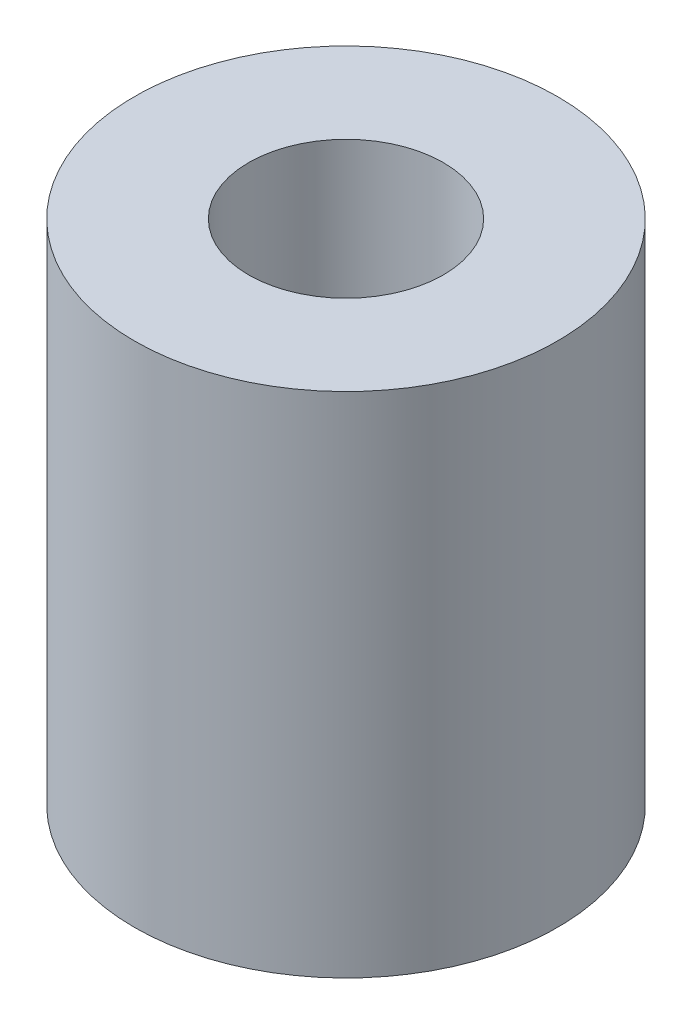
ISO-10303-21;
HEADER;
FILE_DESCRIPTION(('STEP AP214'),'2;1');
FILE_NAME('part.step','',(''),(''),'','','');
FILE_SCHEMA(('AUTOMOTIVE_DESIGN { 1 0 10303 214 1 1 1 1 }'));
ENDSEC;
DATA;
#1=APPLICATION_CONTEXT('core data for automotive mechanical design processes');
#2=APPLICATION_PROTOCOL_DEFINITION('international standard','automotive_design',2000,#1);
#3=PRODUCT_CONTEXT('',#1,'mechanical');
#4=PRODUCT('Part','Part','',(#3));
#5=PRODUCT_RELATED_PRODUCT_CATEGORY('part','',(#4));
#6=PRODUCT_DEFINITION_FORMATION('','',#4);
#7=PRODUCT_DEFINITION_CONTEXT('part definition',#1,'design');
#8=PRODUCT_DEFINITION('design','',#6,#7);
#9=PRODUCT_DEFINITION_SHAPE('','',#8);
#10=(LENGTH_UNIT() NAMED_UNIT(*) SI_UNIT(.MILLI.,.METRE.));
#11=(NAMED_UNIT(*) PLANE_ANGLE_UNIT() SI_UNIT($,.RADIAN.));
#12=(NAMED_UNIT(*) SI_UNIT($,.STERADIAN.) SOLID_ANGLE_UNIT());
#13=UNCERTAINTY_MEASURE_WITH_UNIT(LENGTH_MEASURE(1.E-05),#10,'distance_accuracy_value','');
#14=(GEOMETRIC_REPRESENTATION_CONTEXT(3) GLOBAL_UNCERTAINTY_ASSIGNED_CONTEXT((#13)) GLOBAL_UNIT_ASSIGNED_CONTEXT((#10,
#11,#12)) REPRESENTATION_CONTEXT('',''));
#15=CARTESIAN_POINT('',(0.,0.,0.));
#16=DIRECTION('',(0.,0.,1.));
#17=DIRECTION('',(1.,0.,0.));
#18=AXIS2_PLACEMENT_3D('',#15,#16,#17);
#19=CARTESIAN_POINT('',(0.,0.,0.));
#20=DIRECTION('',(0.,-1.,0.));
#21=DIRECTION('',(0.,0.,-1.));
#22=AXIS2_PLACEMENT_3D('',#19,#20,#21);
#23=CYLINDRICAL_SURFACE('',#22,2.3);
#24=CARTESIAN_POINT('',(0.,0.,0.));
#25=DIRECTION('',(0.,-1.,0.));
#26=DIRECTION('',(0.,0.,-1.));
#27=AXIS2_PLACEMENT_3D('',#24,#25,#26);
#28=CIRCLE('',#27,2.3);
#29=CARTESIAN_POINT('',(0.,0.,-2.3));
#30=VERTEX_POINT('',#29);
#31=EDGE_CURVE('E10',#30,#30,#28,.T.);
#32=ORIENTED_EDGE('',*,*,#31,.T.);
#33=EDGE_LOOP('',(#32));
#34=FACE_BOUND('',#33,.T.);
#35=CARTESIAN_POINT('',(0.,12.,0.));
#36=DIRECTION('',(0.,-1.,0.));
#37=DIRECTION('',(0.,0.,-1.));
#38=AXIS2_PLACEMENT_3D('',#35,#36,#37);
#39=CIRCLE('',#38,2.3);
#40=CARTESIAN_POINT('',(0.,12.,-2.3));
#41=VERTEX_POINT('',#40);
#42=EDGE_CURVE('E54',#41,#41,#39,.T.);
#43=ORIENTED_EDGE('',*,*,#42,.F.);
#44=EDGE_LOOP('',(#43));
#45=FACE_BOUND('',#44,.T.);
#46=ADVANCED_FACE('F37',(#34,#45),#23,.F.);
#47=CARTESIAN_POINT('',(2.3,0.,0.));
#48=DIRECTION('',(0.,-1.,0.));
#49=DIRECTION('',(0.,0.,-1.));
#50=AXIS2_PLACEMENT_3D('',#47,#48,#49);
#51=PLANE('',#50);
#52=CARTESIAN_POINT('',(0.,0.,0.));
#53=DIRECTION('',(0.,-1.,0.));
#54=DIRECTION('',(0.,0.,-1.));
#55=AXIS2_PLACEMENT_3D('',#52,#53,#54);
#56=CIRCLE('',#55,5.);
#57=CARTESIAN_POINT('',(0.,0.,-5.));
#58=VERTEX_POINT('',#57);
#59=EDGE_CURVE('E44',#58,#58,#56,.T.);
#60=ORIENTED_EDGE('',*,*,#59,.T.);
#61=EDGE_LOOP('',(#60));
#62=FACE_BOUND('',#61,.T.);
#63=ORIENTED_EDGE('',*,*,#31,.F.);
#64=EDGE_LOOP('',(#63));
#65=FACE_BOUND('',#64,.T.);
#66=ADVANCED_FACE('F65',(#62,#65),#51,.T.);
#67=CARTESIAN_POINT('',(0.,0.,0.));
#68=DIRECTION('',(0.,-1.,0.));
#69=DIRECTION('',(0.,0.,-1.));
#70=AXIS2_PLACEMENT_3D('',#67,#68,#69);
#71=CYLINDRICAL_SURFACE('',#70,5.);
#72=CARTESIAN_POINT('',(0.,12.,0.));
#73=DIRECTION('',(0.,-1.,0.));
#74=DIRECTION('',(0.,0.,-1.));
#75=AXIS2_PLACEMENT_3D('',#72,#73,#74);
#76=CIRCLE('',#75,5.);
#77=CARTESIAN_POINT('',(0.,12.,-5.));
#78=VERTEX_POINT('',#77);
#79=EDGE_CURVE('E49',#78,#78,#76,.T.);
#80=ORIENTED_EDGE('',*,*,#79,.T.);
#81=EDGE_LOOP('',(#80));
#82=FACE_BOUND('',#81,.T.);
#83=ORIENTED_EDGE('',*,*,#59,.F.);
#84=EDGE_LOOP('',(#83));
#85=FACE_BOUND('',#84,.T.);
#86=ADVANCED_FACE('F69',(#82,#85),#71,.T.);
#87=CARTESIAN_POINT('',(5.,12.,0.));
#88=DIRECTION('',(0.,1.,0.));
#89=DIRECTION('',(0.,0.,1.));
#90=AXIS2_PLACEMENT_3D('',#87,#88,#89);
#91=PLANE('',#90);
#92=ORIENTED_EDGE('',*,*,#42,.T.);
#93=EDGE_LOOP('',(#92));
#94=FACE_BOUND('',#93,.T.);
#95=ORIENTED_EDGE('',*,*,#79,.F.);
#96=EDGE_LOOP('',(#95));
#97=FACE_BOUND('',#96,.T.);
#98=ADVANCED_FACE('F61',(#94,#97),#91,.T.);
#99=CLOSED_SHELL('',(#46,#66,#86,#98));
#100=MANIFOLD_SOLID_BREP('B2',#99);
#101=ADVANCED_BREP_SHAPE_REPRESENTATION('',(#18,#100),#14);
#102=SHAPE_DEFINITION_REPRESENTATION(#9,#101);
ENDSEC;
END-ISO-10303-21;
